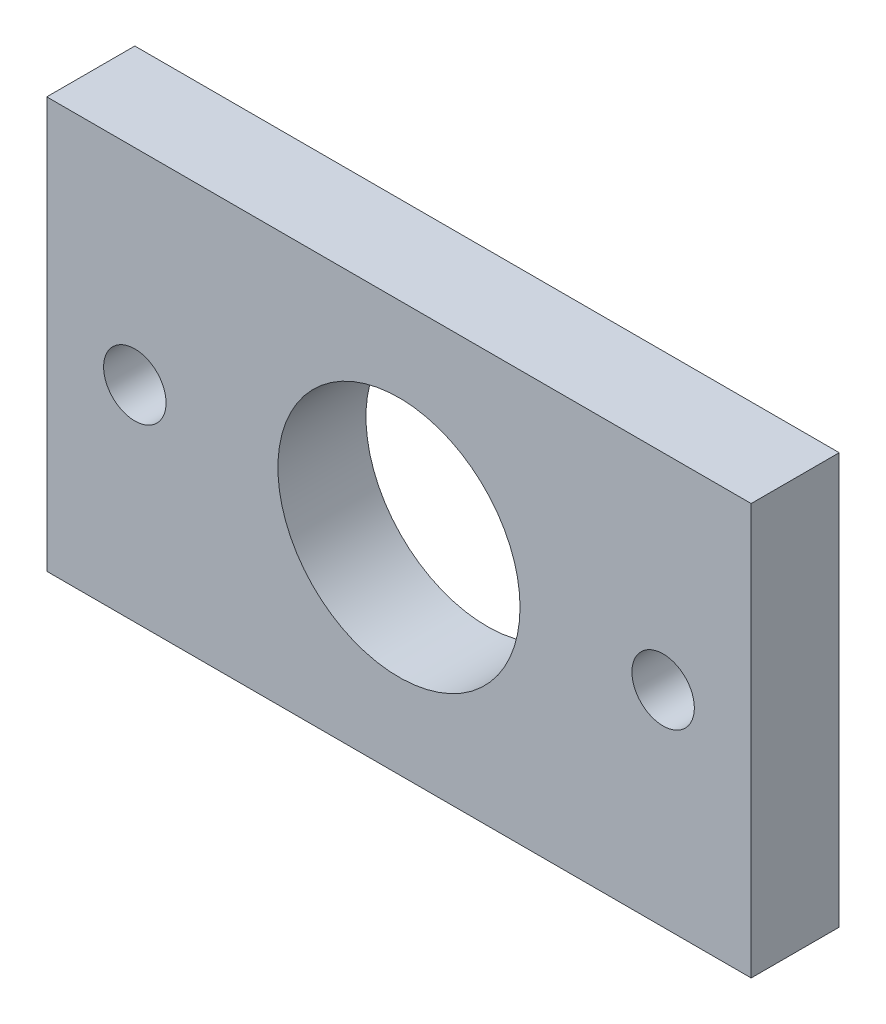
ISO-10303-21;
HEADER;
FILE_DESCRIPTION(('STEP AP214'),'2;1');
FILE_NAME('part.step','',(''),(''),'','','');
FILE_SCHEMA(('AUTOMOTIVE_DESIGN { 1 0 10303 214 1 1 1 1 }'));
ENDSEC;
DATA;
#1=APPLICATION_CONTEXT('core data for automotive mechanical design processes');
#2=APPLICATION_PROTOCOL_DEFINITION('international standard','automotive_design',2000,#1);
#3=PRODUCT_CONTEXT('',#1,'mechanical');
#4=PRODUCT('Part','Part','',(#3));
#5=PRODUCT_RELATED_PRODUCT_CATEGORY('part','',(#4));
#6=PRODUCT_DEFINITION_FORMATION('','',#4);
#7=PRODUCT_DEFINITION_CONTEXT('part definition',#1,'design');
#8=PRODUCT_DEFINITION('design','',#6,#7);
#9=PRODUCT_DEFINITION_SHAPE('','',#8);
#10=(LENGTH_UNIT() NAMED_UNIT(*) SI_UNIT(.MILLI.,.METRE.));
#11=(NAMED_UNIT(*) PLANE_ANGLE_UNIT() SI_UNIT($,.RADIAN.));
#12=(NAMED_UNIT(*) SI_UNIT($,.STERADIAN.) SOLID_ANGLE_UNIT());
#13=UNCERTAINTY_MEASURE_WITH_UNIT(LENGTH_MEASURE(1.E-05),#10,'distance_accuracy_value','');
#14=(GEOMETRIC_REPRESENTATION_CONTEXT(3) GLOBAL_UNCERTAINTY_ASSIGNED_CONTEXT((#13)) GLOBAL_UNIT_ASSIGNED_CONTEXT((#10,
#11,#12)) REPRESENTATION_CONTEXT('',''));
#15=CARTESIAN_POINT('',(0.,0.,0.));
#16=DIRECTION('',(0.,0.,1.));
#17=DIRECTION('',(1.,0.,0.));
#18=AXIS2_PLACEMENT_3D('',#15,#16,#17);
#19=CARTESIAN_POINT('',(38.1,-22.225,9.525));
#20=DIRECTION('',(-1.,0.,0.));
#21=DIRECTION('',(0.,0.,1.));
#22=AXIS2_PLACEMENT_3D('',#19,#20,#21);
#23=PLANE('',#22);
#24=DIRECTION('',(0.,1.,0.));
#25=VECTOR('',#24,1.);
#26=CARTESIAN_POINT('',(38.1,-22.225,0.));
#27=LINE('',#26,#25);
#28=CARTESIAN_POINT('',(38.1,-22.225,0.));
#29=VERTEX_POINT('',#28);
#30=CARTESIAN_POINT('',(38.1,22.225,0.));
#31=VERTEX_POINT('',#30);
#32=EDGE_CURVE('E98',#29,#31,#27,.T.);
#33=ORIENTED_EDGE('',*,*,#32,.T.);
#34=DIRECTION('',(0.,0.,-1.));
#35=VECTOR('',#34,1.);
#36=CARTESIAN_POINT('',(38.1,22.225,9.525));
#37=LINE('',#36,#35);
#38=CARTESIAN_POINT('',(38.1,22.225,9.525));
#39=VERTEX_POINT('',#38);
#40=EDGE_CURVE('E11',#39,#31,#37,.T.);
#41=ORIENTED_EDGE('',*,*,#40,.F.);
#42=DIRECTION('',(0.,1.,0.));
#43=VECTOR('',#42,1.);
#44=CARTESIAN_POINT('',(38.1,-22.225,9.525));
#45=LINE('',#44,#43);
#46=CARTESIAN_POINT('',(38.1,-22.225,9.525));
#47=VERTEX_POINT('',#46);
#48=EDGE_CURVE('E86',#47,#39,#45,.T.);
#49=ORIENTED_EDGE('',*,*,#48,.F.);
#50=DIRECTION('',(0.,0.,-1.));
#51=VECTOR('',#50,1.);
#52=CARTESIAN_POINT('',(38.1,-22.225,9.525));
#53=LINE('',#52,#51);
#54=EDGE_CURVE('E94',#47,#29,#53,.T.);
#55=ORIENTED_EDGE('',*,*,#54,.T.);
#56=EDGE_LOOP('',(#33,#41,#49,#55));
#57=FACE_BOUND('',#56,.T.);
#58=ADVANCED_FACE('F35',(#57),#23,.F.);
#59=CARTESIAN_POINT('',(-38.1,22.225,9.525));
#60=DIRECTION('',(0.,-1.,0.));
#61=DIRECTION('',(0.,0.,-1.));
#62=AXIS2_PLACEMENT_3D('',#59,#60,#61);
#63=PLANE('',#62);
#64=DIRECTION('',(-1.,0.,0.));
#65=VECTOR('',#64,1.);
#66=CARTESIAN_POINT('',(-38.1,22.225,0.));
#67=LINE('',#66,#65);
#68=CARTESIAN_POINT('',(-38.1,22.225,0.));
#69=VERTEX_POINT('',#68);
#70=EDGE_CURVE('E90',#31,#69,#67,.T.);
#71=ORIENTED_EDGE('',*,*,#70,.T.);
#72=DIRECTION('',(0.,0.,-1.));
#73=VECTOR('',#72,1.);
#74=CARTESIAN_POINT('',(-38.1,22.225,9.525));
#75=LINE('',#74,#73);
#76=CARTESIAN_POINT('',(-38.1,22.225,9.525));
#77=VERTEX_POINT('',#76);
#78=EDGE_CURVE('E43',#77,#69,#75,.T.);
#79=ORIENTED_EDGE('',*,*,#78,.F.);
#80=DIRECTION('',(-1.,0.,0.));
#81=VECTOR('',#80,1.);
#82=CARTESIAN_POINT('',(-38.1,22.225,9.525));
#83=LINE('',#82,#81);
#84=EDGE_CURVE('E81',#39,#77,#83,.T.);
#85=ORIENTED_EDGE('',*,*,#84,.F.);
#86=ORIENTED_EDGE('',*,*,#40,.T.);
#87=EDGE_LOOP('',(#71,#79,#85,#86));
#88=FACE_BOUND('',#87,.T.);
#89=ADVANCED_FACE('F89',(#88),#63,.F.);
#90=CARTESIAN_POINT('',(-38.1,-22.225,9.525));
#91=DIRECTION('',(1.,0.,0.));
#92=DIRECTION('',(0.,0.,-1.));
#93=AXIS2_PLACEMENT_3D('',#90,#91,#92);
#94=PLANE('',#93);
#95=DIRECTION('',(0.,-1.,0.));
#96=VECTOR('',#95,1.);
#97=CARTESIAN_POINT('',(-38.1,-22.225,0.));
#98=LINE('',#97,#96);
#99=CARTESIAN_POINT('',(-38.1,-22.225,0.));
#100=VERTEX_POINT('',#99);
#101=EDGE_CURVE('E68',#69,#100,#98,.T.);
#102=ORIENTED_EDGE('',*,*,#101,.T.);
#103=DIRECTION('',(0.,0.,-1.));
#104=VECTOR('',#103,1.);
#105=CARTESIAN_POINT('',(-38.1,-22.225,9.525));
#106=LINE('',#105,#104);
#107=CARTESIAN_POINT('',(-38.1,-22.225,9.525));
#108=VERTEX_POINT('',#107);
#109=EDGE_CURVE('E91',#108,#100,#106,.T.);
#110=ORIENTED_EDGE('',*,*,#109,.F.);
#111=DIRECTION('',(0.,-1.,0.));
#112=VECTOR('',#111,1.);
#113=CARTESIAN_POINT('',(-38.1,-22.225,9.525));
#114=LINE('',#113,#112);
#115=EDGE_CURVE('E84',#77,#108,#114,.T.);
#116=ORIENTED_EDGE('',*,*,#115,.F.);
#117=ORIENTED_EDGE('',*,*,#78,.T.);
#118=EDGE_LOOP('',(#102,#110,#116,#117));
#119=FACE_BOUND('',#118,.T.);
#120=ADVANCED_FACE('F92',(#119),#94,.F.);
#121=CARTESIAN_POINT('',(-38.1,-22.225,9.525));
#122=DIRECTION('',(0.,1.,0.));
#123=DIRECTION('',(0.,0.,1.));
#124=AXIS2_PLACEMENT_3D('',#121,#122,#123);
#125=PLANE('',#124);
#126=DIRECTION('',(1.,0.,0.));
#127=VECTOR('',#126,1.);
#128=CARTESIAN_POINT('',(-38.1,-22.225,0.));
#129=LINE('',#128,#127);
#130=EDGE_CURVE('E74',#100,#29,#129,.T.);
#131=ORIENTED_EDGE('',*,*,#130,.T.);
#132=ORIENTED_EDGE('',*,*,#54,.F.);
#133=DIRECTION('',(1.,0.,0.));
#134=VECTOR('',#133,1.);
#135=CARTESIAN_POINT('',(-38.1,-22.225,9.525));
#136=LINE('',#135,#134);
#137=EDGE_CURVE('E51',#108,#47,#136,.T.);
#138=ORIENTED_EDGE('',*,*,#137,.F.);
#139=ORIENTED_EDGE('',*,*,#109,.T.);
#140=EDGE_LOOP('',(#131,#132,#138,#139));
#141=FACE_BOUND('',#140,.T.);
#142=ADVANCED_FACE('F106',(#141),#125,.F.);
#143=CARTESIAN_POINT('',(0.,0.,9.525));
#144=DIRECTION('',(0.,0.,-1.));
#145=DIRECTION('',(-1.,0.,0.));
#146=AXIS2_PLACEMENT_3D('',#143,#144,#145);
#147=PLANE('',#146);
#148=CARTESIAN_POINT('',(-28.575,0.,9.525));
#149=DIRECTION('',(0.,0.,1.));
#150=DIRECTION('',(1.,0.,0.));
#151=AXIS2_PLACEMENT_3D('',#148,#149,#150);
#152=CIRCLE('',#151,3.3782);
#153=CARTESIAN_POINT('',(-25.1968,0.,9.525));
#154=VERTEX_POINT('',#153);
#155=EDGE_CURVE('E126',#154,#154,#152,.T.);
#156=ORIENTED_EDGE('',*,*,#155,.F.);
#157=EDGE_LOOP('',(#156));
#158=FACE_BOUND('',#157,.T.);
#159=CARTESIAN_POINT('',(28.575,0.,9.525));
#160=DIRECTION('',(0.,0.,1.));
#161=DIRECTION('',(1.,0.,0.));
#162=AXIS2_PLACEMENT_3D('',#159,#160,#161);
#163=CIRCLE('',#162,3.3782);
#164=CARTESIAN_POINT('',(31.9532,0.,9.525));
#165=VERTEX_POINT('',#164);
#166=EDGE_CURVE('E120',#165,#165,#163,.T.);
#167=ORIENTED_EDGE('',*,*,#166,.F.);
#168=EDGE_LOOP('',(#167));
#169=FACE_BOUND('',#168,.T.);
#170=CARTESIAN_POINT('',(0.,0.,9.525));
#171=DIRECTION('',(0.,0.,1.));
#172=DIRECTION('',(1.,0.,0.));
#173=AXIS2_PLACEMENT_3D('',#170,#171,#172);
#174=CIRCLE('',#173,13.09624);
#175=CARTESIAN_POINT('',(13.09624,0.,9.525));
#176=VERTEX_POINT('',#175);
#177=EDGE_CURVE('E114',#176,#176,#174,.T.);
#178=ORIENTED_EDGE('',*,*,#177,.F.);
#179=EDGE_LOOP('',(#178));
#180=FACE_BOUND('',#179,.T.);
#181=ORIENTED_EDGE('',*,*,#48,.T.);
#182=ORIENTED_EDGE('',*,*,#84,.T.);
#183=ORIENTED_EDGE('',*,*,#115,.T.);
#184=ORIENTED_EDGE('',*,*,#137,.T.);
#185=EDGE_LOOP('',(#181,#182,#183,#184));
#186=FACE_BOUND('',#185,.T.);
#187=ADVANCED_FACE('F82',(#158,#169,#180,#186),#147,.F.);
#188=CARTESIAN_POINT('',(0.,0.,0.));
#189=DIRECTION('',(0.,0.,-1.));
#190=DIRECTION('',(-1.,0.,0.));
#191=AXIS2_PLACEMENT_3D('',#188,#189,#190);
#192=PLANE('',#191);
#193=CARTESIAN_POINT('',(-28.575,0.,0.));
#194=DIRECTION('',(0.,0.,1.));
#195=DIRECTION('',(1.,0.,0.));
#196=AXIS2_PLACEMENT_3D('',#193,#194,#195);
#197=CIRCLE('',#196,3.3782);
#198=CARTESIAN_POINT('',(-25.1968,0.,0.));
#199=VERTEX_POINT('',#198);
#200=EDGE_CURVE('E123',#199,#199,#197,.T.);
#201=ORIENTED_EDGE('',*,*,#200,.T.);
#202=EDGE_LOOP('',(#201));
#203=FACE_BOUND('',#202,.T.);
#204=CARTESIAN_POINT('',(28.575,0.,0.));
#205=DIRECTION('',(0.,0.,1.));
#206=DIRECTION('',(1.,0.,0.));
#207=AXIS2_PLACEMENT_3D('',#204,#205,#206);
#208=CIRCLE('',#207,3.3782);
#209=CARTESIAN_POINT('',(31.9532,0.,0.));
#210=VERTEX_POINT('',#209);
#211=EDGE_CURVE('E117',#210,#210,#208,.T.);
#212=ORIENTED_EDGE('',*,*,#211,.T.);
#213=EDGE_LOOP('',(#212));
#214=FACE_BOUND('',#213,.T.);
#215=CARTESIAN_POINT('',(0.,0.,0.));
#216=DIRECTION('',(0.,0.,1.));
#217=DIRECTION('',(1.,0.,0.));
#218=AXIS2_PLACEMENT_3D('',#215,#216,#217);
#219=CIRCLE('',#218,13.09624);
#220=CARTESIAN_POINT('',(13.09624,0.,0.));
#221=VERTEX_POINT('',#220);
#222=EDGE_CURVE('E101',#221,#221,#219,.T.);
#223=ORIENTED_EDGE('',*,*,#222,.T.);
#224=EDGE_LOOP('',(#223));
#225=FACE_BOUND('',#224,.T.);
#226=ORIENTED_EDGE('',*,*,#32,.F.);
#227=ORIENTED_EDGE('',*,*,#130,.F.);
#228=ORIENTED_EDGE('',*,*,#101,.F.);
#229=ORIENTED_EDGE('',*,*,#70,.F.);
#230=EDGE_LOOP('',(#226,#227,#228,#229));
#231=FACE_BOUND('',#230,.T.);
#232=ADVANCED_FACE('F109',(#203,#214,#225,#231),#192,.T.);
#233=CARTESIAN_POINT('',(0.,0.,9.525));
#234=DIRECTION('',(0.,0.,1.));
#235=DIRECTION('',(1.,0.,0.));
#236=AXIS2_PLACEMENT_3D('',#233,#234,#235);
#237=CYLINDRICAL_SURFACE('',#236,13.09624);
#238=ORIENTED_EDGE('',*,*,#222,.F.);
#239=EDGE_LOOP('',(#238));
#240=FACE_BOUND('',#239,.T.);
#241=ORIENTED_EDGE('',*,*,#177,.T.);
#242=EDGE_LOOP('',(#241));
#243=FACE_BOUND('',#242,.T.);
#244=ADVANCED_FACE('F139',(#240,#243),#237,.F.);
#245=CARTESIAN_POINT('',(28.575,0.,9.525));
#246=DIRECTION('',(0.,0.,1.));
#247=DIRECTION('',(1.,0.,0.));
#248=AXIS2_PLACEMENT_3D('',#245,#246,#247);
#249=CYLINDRICAL_SURFACE('',#248,3.3782);
#250=ORIENTED_EDGE('',*,*,#211,.F.);
#251=EDGE_LOOP('',(#250));
#252=FACE_BOUND('',#251,.T.);
#253=ORIENTED_EDGE('',*,*,#166,.T.);
#254=EDGE_LOOP('',(#253));
#255=FACE_BOUND('',#254,.T.);
#256=ADVANCED_FACE('F141',(#252,#255),#249,.F.);
#257=CARTESIAN_POINT('',(-28.575,0.,9.525));
#258=DIRECTION('',(0.,0.,1.));
#259=DIRECTION('',(1.,0.,0.));
#260=AXIS2_PLACEMENT_3D('',#257,#258,#259);
#261=CYLINDRICAL_SURFACE('',#260,3.3782);
#262=ORIENTED_EDGE('',*,*,#200,.F.);
#263=EDGE_LOOP('',(#262));
#264=FACE_BOUND('',#263,.T.);
#265=ORIENTED_EDGE('',*,*,#155,.T.);
#266=EDGE_LOOP('',(#265));
#267=FACE_BOUND('',#266,.T.);
#268=ADVANCED_FACE('F130',(#264,#267),#261,.F.);
#269=CLOSED_SHELL('',(#58,#89,#120,#142,#187,#232,#244,#256,#268));
#270=MANIFOLD_SOLID_BREP('B2',#269);
#271=ADVANCED_BREP_SHAPE_REPRESENTATION('',(#18,#270),#14);
#272=SHAPE_DEFINITION_REPRESENTATION(#9,#271);
ENDSEC;
END-ISO-10303-21;
